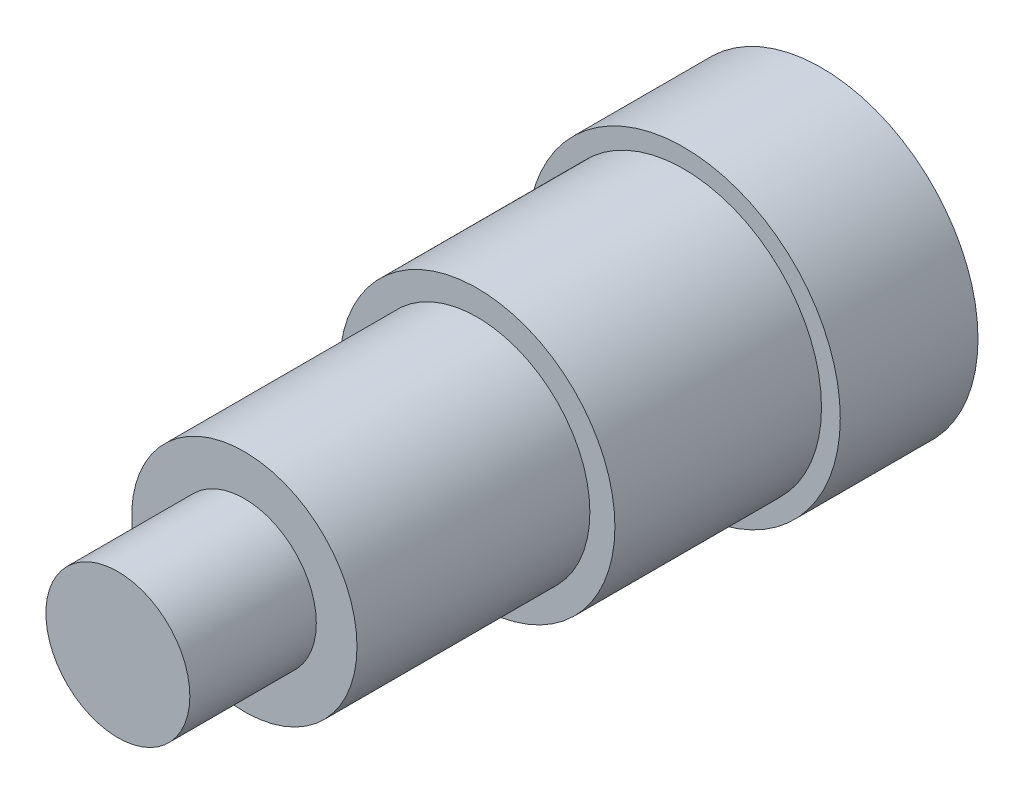
ISO-10303-21;
HEADER;
FILE_DESCRIPTION(('STEP AP214'),'2;1');
FILE_NAME('part.step','',(''),(''),'','','');
FILE_SCHEMA(('AUTOMOTIVE_DESIGN { 1 0 10303 214 1 1 1 1 }'));
ENDSEC;
DATA;
#1=APPLICATION_CONTEXT('core data for automotive mechanical design processes');
#2=APPLICATION_PROTOCOL_DEFINITION('international standard','automotive_design',2000,#1);
#3=PRODUCT_CONTEXT('',#1,'mechanical');
#4=PRODUCT('Part','Part','',(#3));
#5=PRODUCT_RELATED_PRODUCT_CATEGORY('part','',(#4));
#6=PRODUCT_DEFINITION_FORMATION('','',#4);
#7=PRODUCT_DEFINITION_CONTEXT('part definition',#1,'design');
#8=PRODUCT_DEFINITION('design','',#6,#7);
#9=PRODUCT_DEFINITION_SHAPE('','',#8);
#10=(LENGTH_UNIT() NAMED_UNIT(*) SI_UNIT(.MILLI.,.METRE.));
#11=(NAMED_UNIT(*) PLANE_ANGLE_UNIT() SI_UNIT($,.RADIAN.));
#12=(NAMED_UNIT(*) SI_UNIT($,.STERADIAN.) SOLID_ANGLE_UNIT());
#13=UNCERTAINTY_MEASURE_WITH_UNIT(LENGTH_MEASURE(1.E-05),#10,'distance_accuracy_value','');
#14=(GEOMETRIC_REPRESENTATION_CONTEXT(3) GLOBAL_UNCERTAINTY_ASSIGNED_CONTEXT((#13)) GLOBAL_UNIT_ASSIGNED_CONTEXT((#10,
#11,#12)) REPRESENTATION_CONTEXT('',''));
#15=CARTESIAN_POINT('',(0.,0.,0.));
#16=DIRECTION('',(0.,0.,1.));
#17=DIRECTION('',(1.,0.,0.));
#18=AXIS2_PLACEMENT_3D('',#15,#16,#17);
#19=CARTESIAN_POINT('',(0.,0.,46.1));
#20=DIRECTION('',(0.,0.,1.));
#21=DIRECTION('',(1.,0.,0.));
#22=AXIS2_PLACEMENT_3D('',#19,#20,#21);
#23=PLANE('',#22);
#24=CARTESIAN_POINT('',(0.,0.,46.1));
#25=DIRECTION('',(0.,0.,1.));
#26=DIRECTION('',(1.,0.,0.));
#27=AXIS2_PLACEMENT_3D('',#24,#25,#26);
#28=CIRCLE('',#27,9.);
#29=CARTESIAN_POINT('',(9.,0.,46.1));
#30=VERTEX_POINT('',#29);
#31=EDGE_CURVE('E54',#30,#30,#28,.T.);
#32=ORIENTED_EDGE('',*,*,#31,.T.);
#33=EDGE_LOOP('',(#32));
#34=FACE_BOUND('',#33,.T.);
#35=CARTESIAN_POINT('',(0.,0.,46.1));
#36=DIRECTION('',(0.,0.,1.));
#37=DIRECTION('',(1.,0.,0.));
#38=AXIS2_PLACEMENT_3D('',#35,#36,#37);
#39=CIRCLE('',#38,5.75);
#40=CARTESIAN_POINT('',(5.75,0.,46.1));
#41=VERTEX_POINT('',#40);
#42=EDGE_CURVE('E63',#41,#41,#39,.T.);
#43=ORIENTED_EDGE('',*,*,#42,.F.);
#44=EDGE_LOOP('',(#43));
#45=FACE_BOUND('',#44,.T.);
#46=ADVANCED_FACE('F36',(#34,#45),#23,.T.);
#47=CARTESIAN_POINT('',(0.,0.,27.5));
#48=DIRECTION('',(0.,0.,1.));
#49=DIRECTION('',(1.,0.,0.));
#50=AXIS2_PLACEMENT_3D('',#47,#48,#49);
#51=PLANE('',#50);
#52=CARTESIAN_POINT('',(0.,0.,27.5));
#53=DIRECTION('',(0.,0.,1.));
#54=DIRECTION('',(1.,0.,0.));
#55=AXIS2_PLACEMENT_3D('',#52,#53,#54);
#56=CIRCLE('',#55,11.);
#57=CARTESIAN_POINT('',(11.,0.,27.5));
#58=VERTEX_POINT('',#57);
#59=EDGE_CURVE('E49',#58,#58,#56,.T.);
#60=ORIENTED_EDGE('',*,*,#59,.T.);
#61=EDGE_LOOP('',(#60));
#62=FACE_BOUND('',#61,.T.);
#63=CARTESIAN_POINT('',(0.,0.,27.5));
#64=DIRECTION('',(0.,0.,1.));
#65=DIRECTION('',(1.,0.,0.));
#66=AXIS2_PLACEMENT_3D('',#63,#64,#65);
#67=CIRCLE('',#66,9.);
#68=CARTESIAN_POINT('',(9.,0.,27.5));
#69=VERTEX_POINT('',#68);
#70=EDGE_CURVE('E57',#69,#69,#67,.T.);
#71=ORIENTED_EDGE('',*,*,#70,.F.);
#72=EDGE_LOOP('',(#71));
#73=FACE_BOUND('',#72,.T.);
#74=ADVANCED_FACE('F88',(#62,#73),#51,.T.);
#75=CARTESIAN_POINT('',(0.,0.,11.));
#76=DIRECTION('',(0.,0.,1.));
#77=DIRECTION('',(1.,0.,0.));
#78=AXIS2_PLACEMENT_3D('',#75,#76,#77);
#79=PLANE('',#78);
#80=CARTESIAN_POINT('',(0.,0.,11.));
#81=DIRECTION('',(0.,0.,1.));
#82=DIRECTION('',(1.,0.,0.));
#83=AXIS2_PLACEMENT_3D('',#80,#81,#82);
#84=CIRCLE('',#83,12.5);
#85=CARTESIAN_POINT('',(12.5,0.,11.));
#86=VERTEX_POINT('',#85);
#87=EDGE_CURVE('E10',#86,#86,#84,.T.);
#88=ORIENTED_EDGE('',*,*,#87,.T.);
#89=EDGE_LOOP('',(#88));
#90=FACE_BOUND('',#89,.T.);
#91=CARTESIAN_POINT('',(0.,0.,11.));
#92=DIRECTION('',(0.,0.,1.));
#93=DIRECTION('',(1.,0.,0.));
#94=AXIS2_PLACEMENT_3D('',#91,#92,#93);
#95=CIRCLE('',#94,11.);
#96=CARTESIAN_POINT('',(11.,0.,11.));
#97=VERTEX_POINT('',#96);
#98=EDGE_CURVE('E51',#97,#97,#95,.T.);
#99=ORIENTED_EDGE('',*,*,#98,.F.);
#100=EDGE_LOOP('',(#99));
#101=FACE_BOUND('',#100,.T.);
#102=ADVANCED_FACE('F94',(#90,#101),#79,.T.);
#103=CARTESIAN_POINT('',(0.,0.,11.));
#104=DIRECTION('',(0.,0.,-1.));
#105=DIRECTION('',(-1.,0.,0.));
#106=AXIS2_PLACEMENT_3D('',#103,#104,#105);
#107=CYLINDRICAL_SURFACE('',#106,12.5);
#108=ORIENTED_EDGE('',*,*,#87,.F.);
#109=EDGE_LOOP('',(#108));
#110=FACE_BOUND('',#109,.T.);
#111=CARTESIAN_POINT('',(0.,0.,0.));
#112=DIRECTION('',(0.,0.,1.));
#113=DIRECTION('',(1.,0.,0.));
#114=AXIS2_PLACEMENT_3D('',#111,#112,#113);
#115=CIRCLE('',#114,12.5);
#116=CARTESIAN_POINT('',(12.5,0.,0.));
#117=VERTEX_POINT('',#116);
#118=EDGE_CURVE('E44',#117,#117,#115,.T.);
#119=ORIENTED_EDGE('',*,*,#118,.T.);
#120=EDGE_LOOP('',(#119));
#121=FACE_BOUND('',#120,.T.);
#122=ADVANCED_FACE('F111',(#110,#121),#107,.T.);
#123=CARTESIAN_POINT('',(0.,0.,0.));
#124=DIRECTION('',(0.,0.,1.));
#125=DIRECTION('',(1.,0.,0.));
#126=AXIS2_PLACEMENT_3D('',#123,#124,#125);
#127=PLANE('',#126);
#128=CARTESIAN_POINT('',(0.,0.,0.));
#129=DIRECTION('',(0.,0.,-1.));
#130=DIRECTION('',(-1.,0.,0.));
#131=AXIS2_PLACEMENT_3D('',#128,#129,#130);
#132=CIRCLE('',#131,11.75);
#133=CARTESIAN_POINT('',(-11.75,0.,0.));
#134=VERTEX_POINT('',#133);
#135=EDGE_CURVE('E66',#134,#134,#132,.T.);
#136=ORIENTED_EDGE('',*,*,#135,.F.);
#137=EDGE_LOOP('',(#136));
#138=FACE_BOUND('',#137,.T.);
#139=ORIENTED_EDGE('',*,*,#118,.F.);
#140=EDGE_LOOP('',(#139));
#141=FACE_BOUND('',#140,.T.);
#142=ADVANCED_FACE('F107',(#138,#141),#127,.F.);
#143=CARTESIAN_POINT('',(0.,0.,27.5));
#144=DIRECTION('',(0.,0.,-1.));
#145=DIRECTION('',(-1.,0.,0.));
#146=AXIS2_PLACEMENT_3D('',#143,#144,#145);
#147=CYLINDRICAL_SURFACE('',#146,11.);
#148=ORIENTED_EDGE('',*,*,#59,.F.);
#149=EDGE_LOOP('',(#148));
#150=FACE_BOUND('',#149,.T.);
#151=ORIENTED_EDGE('',*,*,#98,.T.);
#152=EDGE_LOOP('',(#151));
#153=FACE_BOUND('',#152,.T.);
#154=ADVANCED_FACE('F102',(#150,#153),#147,.T.);
#155=CARTESIAN_POINT('',(0.,0.,46.1));
#156=DIRECTION('',(0.,0.,-1.));
#157=DIRECTION('',(-1.,0.,0.));
#158=AXIS2_PLACEMENT_3D('',#155,#156,#157);
#159=CYLINDRICAL_SURFACE('',#158,9.);
#160=ORIENTED_EDGE('',*,*,#31,.F.);
#161=EDGE_LOOP('',(#160));
#162=FACE_BOUND('',#161,.T.);
#163=ORIENTED_EDGE('',*,*,#70,.T.);
#164=EDGE_LOOP('',(#163));
#165=FACE_BOUND('',#164,.T.);
#166=ADVANCED_FACE('F100',(#162,#165),#159,.T.);
#167=CARTESIAN_POINT('',(0.,0.,56.2));
#168=DIRECTION('',(0.,0.,-1.));
#169=DIRECTION('',(-1.,0.,0.));
#170=AXIS2_PLACEMENT_3D('',#167,#168,#169);
#171=CYLINDRICAL_SURFACE('',#170,5.75);
#172=CARTESIAN_POINT('',(0.,0.,56.2));
#173=DIRECTION('',(0.,0.,1.));
#174=DIRECTION('',(1.,0.,0.));
#175=AXIS2_PLACEMENT_3D('',#172,#173,#174);
#176=CIRCLE('',#175,5.75);
#177=CARTESIAN_POINT('',(5.75,0.,56.2));
#178=VERTEX_POINT('',#177);
#179=EDGE_CURVE('E60',#178,#178,#176,.T.);
#180=ORIENTED_EDGE('',*,*,#179,.F.);
#181=EDGE_LOOP('',(#180));
#182=FACE_BOUND('',#181,.T.);
#183=ORIENTED_EDGE('',*,*,#42,.T.);
#184=EDGE_LOOP('',(#183));
#185=FACE_BOUND('',#184,.T.);
#186=ADVANCED_FACE('F84',(#182,#185),#171,.T.);
#187=CARTESIAN_POINT('',(0.,0.,56.2));
#188=DIRECTION('',(0.,0.,1.));
#189=DIRECTION('',(1.,0.,0.));
#190=AXIS2_PLACEMENT_3D('',#187,#188,#189);
#191=PLANE('',#190);
#192=ORIENTED_EDGE('',*,*,#179,.T.);
#193=EDGE_LOOP('',(#192));
#194=FACE_BOUND('',#193,.T.);
#195=ADVANCED_FACE('F78',(#194),#191,.T.);
#196=CARTESIAN_POINT('',(0.,0.,4.5));
#197=DIRECTION('',(0.,0.,-1.));
#198=DIRECTION('',(-1.,0.,0.));
#199=AXIS2_PLACEMENT_3D('',#196,#197,#198);
#200=CYLINDRICAL_SURFACE('',#199,11.75);
#201=CARTESIAN_POINT('',(0.,0.,2.5));
#202=DIRECTION('',(0.,0.,-1.));
#203=DIRECTION('',(-1.,0.,0.));
#204=AXIS2_PLACEMENT_3D('',#201,#202,#203);
#205=CIRCLE('',#204,11.75);
#206=CARTESIAN_POINT('',(-11.75,0.,2.5));
#207=VERTEX_POINT('',#206);
#208=EDGE_CURVE('E40',#207,#207,#205,.T.);
#209=ORIENTED_EDGE('',*,*,#208,.F.);
#210=EDGE_LOOP('',(#209));
#211=FACE_BOUND('',#210,.T.);
#212=ORIENTED_EDGE('',*,*,#135,.T.);
#213=EDGE_LOOP('',(#212));
#214=FACE_BOUND('',#213,.T.);
#215=ADVANCED_FACE('F76',(#211,#214),#200,.F.);
#216=CARTESIAN_POINT('',(0.,0.,12.3011363636364));
#217=DIRECTION('',(0.,0.,1.));
#218=DIRECTION('',(1.,0.,0.));
#219=AXIS2_PLACEMENT_3D('',#216,#217,#218);
#220=SPHERICAL_SURFACE('',#219,15.3011363636364);
#221=ORIENTED_EDGE('',*,*,#208,.T.);
#222=EDGE_LOOP('',(#221));
#223=FACE_BOUND('',#222,.T.);
#224=ADVANCED_FACE('F38',(#223),#220,.T.);
#225=CLOSED_SHELL('',(#46,#74,#102,#122,#142,#154,#166,#186,#195,#215,#224));
#226=MANIFOLD_SOLID_BREP('B2',#225);
#227=ADVANCED_BREP_SHAPE_REPRESENTATION('',(#18,#226),#14);
#228=SHAPE_DEFINITION_REPRESENTATION(#9,#227);
ENDSEC;
END-ISO-10303-21;
